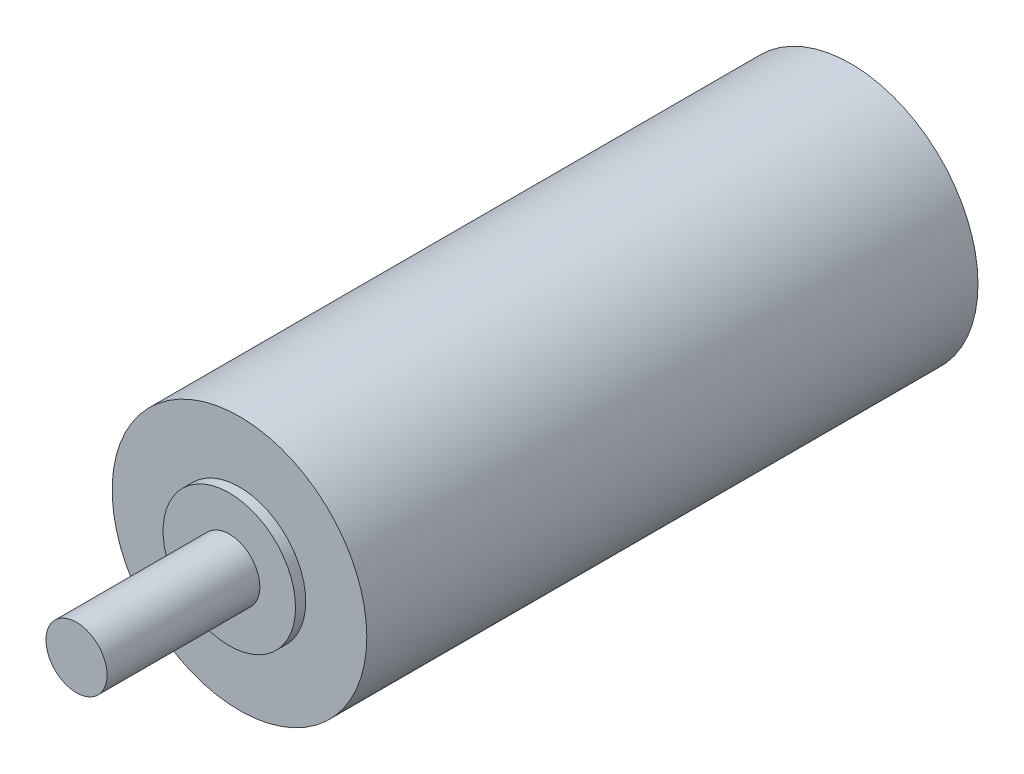
ISO-10303-21;
HEADER;
FILE_DESCRIPTION(('STEP AP214'),'2;1');
FILE_NAME('part.step','',(''),(''),'','','');
FILE_SCHEMA(('AUTOMOTIVE_DESIGN { 1 0 10303 214 1 1 1 1 }'));
ENDSEC;
DATA;
#1=APPLICATION_CONTEXT('core data for automotive mechanical design processes');
#2=APPLICATION_PROTOCOL_DEFINITION('international standard','automotive_design',2000,#1);
#3=PRODUCT_CONTEXT('',#1,'mechanical');
#4=PRODUCT('Part','Part','',(#3));
#5=PRODUCT_RELATED_PRODUCT_CATEGORY('part','',(#4));
#6=PRODUCT_DEFINITION_FORMATION('','',#4);
#7=PRODUCT_DEFINITION_CONTEXT('part definition',#1,'design');
#8=PRODUCT_DEFINITION('design','',#6,#7);
#9=PRODUCT_DEFINITION_SHAPE('','',#8);
#10=(LENGTH_UNIT() NAMED_UNIT(*) SI_UNIT(.MILLI.,.METRE.));
#11=(NAMED_UNIT(*) PLANE_ANGLE_UNIT() SI_UNIT($,.RADIAN.));
#12=(NAMED_UNIT(*) SI_UNIT($,.STERADIAN.) SOLID_ANGLE_UNIT());
#13=UNCERTAINTY_MEASURE_WITH_UNIT(LENGTH_MEASURE(1.E-05),#10,'distance_accuracy_value','');
#14=(GEOMETRIC_REPRESENTATION_CONTEXT(3) GLOBAL_UNCERTAINTY_ASSIGNED_CONTEXT((#13)) GLOBAL_UNIT_ASSIGNED_CONTEXT((#10,
#11,#12)) REPRESENTATION_CONTEXT('',''));
#15=CARTESIAN_POINT('',(0.,0.,0.));
#16=DIRECTION('',(0.,0.,1.));
#17=DIRECTION('',(1.,0.,0.));
#18=AXIS2_PLACEMENT_3D('',#15,#16,#17);
#19=CARTESIAN_POINT('',(0.,0.,60.));
#20=DIRECTION('',(0.,0.,-1.));
#21=DIRECTION('',(-1.,0.,0.));
#22=AXIS2_PLACEMENT_3D('',#19,#20,#21);
#23=CYLINDRICAL_SURFACE('',#22,12.5);
#24=CARTESIAN_POINT('',(0.,0.,60.));
#25=DIRECTION('',(0.,0.,1.));
#26=DIRECTION('',(1.,0.,0.));
#27=AXIS2_PLACEMENT_3D('',#24,#25,#26);
#28=CIRCLE('',#27,12.5);
#29=CARTESIAN_POINT('',(12.5,0.,60.));
#30=VERTEX_POINT('',#29);
#31=EDGE_CURVE('E54',#30,#30,#28,.T.);
#32=ORIENTED_EDGE('',*,*,#31,.F.);
#33=EDGE_LOOP('',(#32));
#34=FACE_BOUND('',#33,.T.);
#35=CARTESIAN_POINT('',(0.,0.,0.));
#36=DIRECTION('',(0.,0.,1.));
#37=DIRECTION('',(1.,0.,0.));
#38=AXIS2_PLACEMENT_3D('',#35,#36,#37);
#39=CIRCLE('',#38,12.5);
#40=CARTESIAN_POINT('',(12.5,0.,0.));
#41=VERTEX_POINT('',#40);
#42=EDGE_CURVE('E45',#41,#41,#39,.T.);
#43=ORIENTED_EDGE('',*,*,#42,.T.);
#44=EDGE_LOOP('',(#43));
#45=FACE_BOUND('',#44,.T.);
#46=ADVANCED_FACE('F42',(#34,#45),#23,.T.);
#47=CARTESIAN_POINT('',(0.,0.,60.));
#48=DIRECTION('',(0.,0.,1.));
#49=DIRECTION('',(1.,0.,0.));
#50=AXIS2_PLACEMENT_3D('',#47,#48,#49);
#51=PLANE('',#50);
#52=CARTESIAN_POINT('',(0.,0.,60.));
#53=DIRECTION('',(0.,0.,1.));
#54=DIRECTION('',(1.,0.,0.));
#55=AXIS2_PLACEMENT_3D('',#52,#53,#54);
#56=CIRCLE('',#55,6.5);
#57=CARTESIAN_POINT('',(6.5,0.,60.));
#58=VERTEX_POINT('',#57);
#59=EDGE_CURVE('E49',#58,#58,#56,.T.);
#60=ORIENTED_EDGE('',*,*,#59,.F.);
#61=EDGE_LOOP('',(#60));
#62=FACE_BOUND('',#61,.T.);
#63=ORIENTED_EDGE('',*,*,#31,.T.);
#64=EDGE_LOOP('',(#63));
#65=FACE_BOUND('',#64,.T.);
#66=ADVANCED_FACE('F71',(#62,#65),#51,.T.);
#67=CARTESIAN_POINT('',(0.,0.,0.));
#68=DIRECTION('',(0.,0.,1.));
#69=DIRECTION('',(1.,0.,0.));
#70=AXIS2_PLACEMENT_3D('',#67,#68,#69);
#71=PLANE('',#70);
#72=ORIENTED_EDGE('',*,*,#42,.F.);
#73=EDGE_LOOP('',(#72));
#74=FACE_BOUND('',#73,.T.);
#75=ADVANCED_FACE('F68',(#74),#71,.F.);
#76=CARTESIAN_POINT('',(0.,0.,61.));
#77=DIRECTION('',(0.,0.,-1.));
#78=DIRECTION('',(-1.,0.,0.));
#79=AXIS2_PLACEMENT_3D('',#76,#77,#78);
#80=CYLINDRICAL_SURFACE('',#79,6.5);
#81=CARTESIAN_POINT('',(0.,0.,61.));
#82=DIRECTION('',(0.,0.,1.));
#83=DIRECTION('',(1.,0.,0.));
#84=AXIS2_PLACEMENT_3D('',#81,#82,#83);
#85=CIRCLE('',#84,6.5);
#86=CARTESIAN_POINT('',(6.5,0.,61.));
#87=VERTEX_POINT('',#86);
#88=EDGE_CURVE('E59',#87,#87,#85,.T.);
#89=ORIENTED_EDGE('',*,*,#88,.F.);
#90=EDGE_LOOP('',(#89));
#91=FACE_BOUND('',#90,.T.);
#92=ORIENTED_EDGE('',*,*,#59,.T.);
#93=EDGE_LOOP('',(#92));
#94=FACE_BOUND('',#93,.T.);
#95=ADVANCED_FACE('F70',(#91,#94),#80,.T.);
#96=CARTESIAN_POINT('',(0.,0.,61.));
#97=DIRECTION('',(0.,0.,1.));
#98=DIRECTION('',(1.,0.,0.));
#99=AXIS2_PLACEMENT_3D('',#96,#97,#98);
#100=PLANE('',#99);
#101=CARTESIAN_POINT('',(0.,0.,61.));
#102=DIRECTION('',(0.,0.,1.));
#103=DIRECTION('',(1.,0.,0.));
#104=AXIS2_PLACEMENT_3D('',#101,#102,#103);
#105=CIRCLE('',#104,3.);
#106=CARTESIAN_POINT('',(3.,0.,61.));
#107=VERTEX_POINT('',#106);
#108=EDGE_CURVE('E12',#107,#107,#105,.T.);
#109=ORIENTED_EDGE('',*,*,#108,.F.);
#110=EDGE_LOOP('',(#109));
#111=FACE_BOUND('',#110,.T.);
#112=ORIENTED_EDGE('',*,*,#88,.T.);
#113=EDGE_LOOP('',(#112));
#114=FACE_BOUND('',#113,.T.);
#115=ADVANCED_FACE('F76',(#111,#114),#100,.T.);
#116=CARTESIAN_POINT('',(0.,0.,76.));
#117=DIRECTION('',(0.,0.,-1.));
#118=DIRECTION('',(-1.,0.,0.));
#119=AXIS2_PLACEMENT_3D('',#116,#117,#118);
#120=CYLINDRICAL_SURFACE('',#119,3.);
#121=CARTESIAN_POINT('',(0.,0.,76.));
#122=DIRECTION('',(0.,0.,1.));
#123=DIRECTION('',(1.,0.,0.));
#124=AXIS2_PLACEMENT_3D('',#121,#122,#123);
#125=CIRCLE('',#124,3.);
#126=CARTESIAN_POINT('',(3.,0.,76.));
#127=VERTEX_POINT('',#126);
#128=EDGE_CURVE('E58',#127,#127,#125,.T.);
#129=ORIENTED_EDGE('',*,*,#128,.F.);
#130=EDGE_LOOP('',(#129));
#131=FACE_BOUND('',#130,.T.);
#132=ORIENTED_EDGE('',*,*,#108,.T.);
#133=EDGE_LOOP('',(#132));
#134=FACE_BOUND('',#133,.T.);
#135=ADVANCED_FACE('F106',(#131,#134),#120,.T.);
#136=CARTESIAN_POINT('',(0.,0.,76.));
#137=DIRECTION('',(0.,0.,1.));
#138=DIRECTION('',(1.,0.,0.));
#139=AXIS2_PLACEMENT_3D('',#136,#137,#138);
#140=PLANE('',#139);
#141=ORIENTED_EDGE('',*,*,#128,.T.);
#142=EDGE_LOOP('',(#141));
#143=FACE_BOUND('',#142,.T.);
#144=ADVANCED_FACE('F116',(#143),#140,.T.);
#145=CLOSED_SHELL('',(#46,#66,#75,#95,#115,#135,#144));
#146=MANIFOLD_SOLID_BREP('B2',#145);
#147=ADVANCED_BREP_SHAPE_REPRESENTATION('',(#18,#146),#14);
#148=SHAPE_DEFINITION_REPRESENTATION(#9,#147);
ENDSEC;
END-ISO-10303-21;
